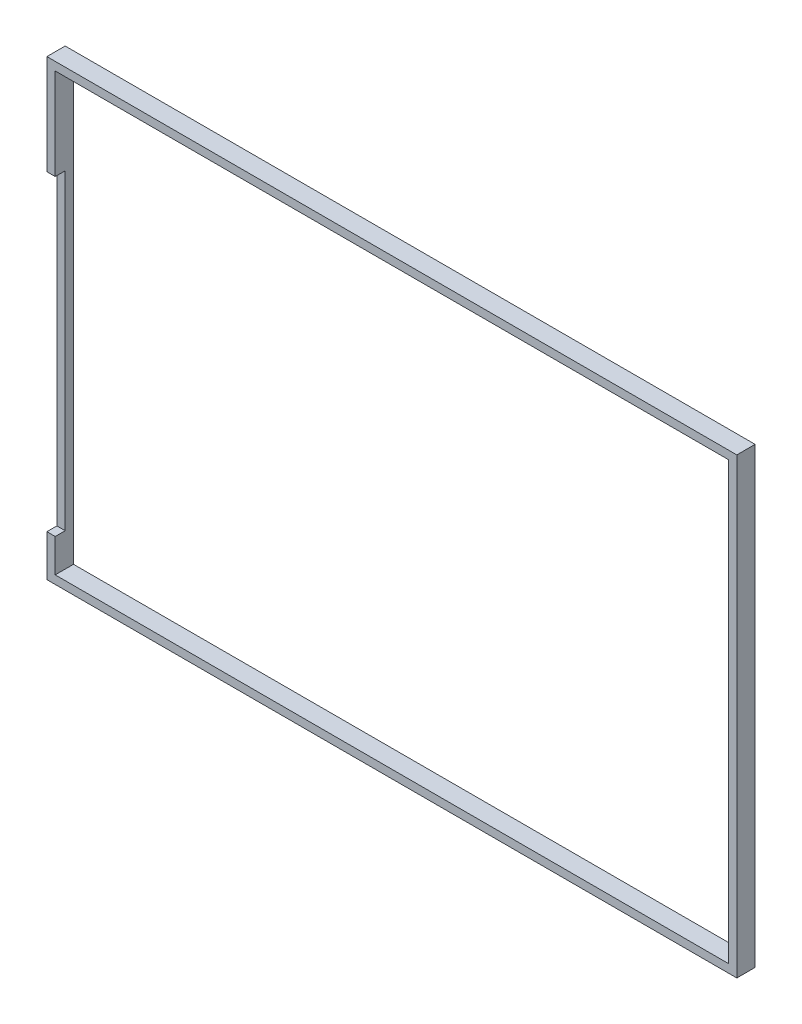
ISO-10303-21;
HEADER;
FILE_DESCRIPTION(('STEP AP214'),'2;1');
FILE_NAME('part.step','',(''),(''),'','','');
FILE_SCHEMA(('AUTOMOTIVE_DESIGN { 1 0 10303 214 1 1 1 1 }'));
ENDSEC;
DATA;
#1=APPLICATION_CONTEXT('core data for automotive mechanical design processes');
#2=APPLICATION_PROTOCOL_DEFINITION('international standard','automotive_design',2000,#1);
#3=PRODUCT_CONTEXT('',#1,'mechanical');
#4=PRODUCT('Part','Part','',(#3));
#5=PRODUCT_RELATED_PRODUCT_CATEGORY('part','',(#4));
#6=PRODUCT_DEFINITION_FORMATION('','',#4);
#7=PRODUCT_DEFINITION_CONTEXT('part definition',#1,'design');
#8=PRODUCT_DEFINITION('design','',#6,#7);
#9=PRODUCT_DEFINITION_SHAPE('','',#8);
#10=(LENGTH_UNIT() NAMED_UNIT(*) SI_UNIT(.MILLI.,.METRE.));
#11=(NAMED_UNIT(*) PLANE_ANGLE_UNIT() SI_UNIT($,.RADIAN.));
#12=(NAMED_UNIT(*) SI_UNIT($,.STERADIAN.) SOLID_ANGLE_UNIT());
#13=UNCERTAINTY_MEASURE_WITH_UNIT(LENGTH_MEASURE(1.E-05),#10,'distance_accuracy_value','');
#14=(GEOMETRIC_REPRESENTATION_CONTEXT(3) GLOBAL_UNCERTAINTY_ASSIGNED_CONTEXT((#13)) GLOBAL_UNIT_ASSIGNED_CONTEXT((#10,
#11,#12)) REPRESENTATION_CONTEXT('',''));
#15=CARTESIAN_POINT('',(0.,0.,0.));
#16=DIRECTION('',(0.,0.,1.));
#17=DIRECTION('',(1.,0.,0.));
#18=AXIS2_PLACEMENT_3D('',#15,#16,#17);
#19=CARTESIAN_POINT('',(-40.5,-22.25,-7.8));
#20=DIRECTION('',(0.,-1.,0.));
#21=DIRECTION('',(1.,0.,0.));
#22=AXIS2_PLACEMENT_3D('',#19,#20,#21);
#23=PLANE('',#22);
#24=DIRECTION('',(0.,0.,1.));
#25=VECTOR('',#24,1.);
#26=CARTESIAN_POINT('',(-41.5,-22.25,2.2));
#27=LINE('',#26,#25);
#28=CARTESIAN_POINT('',(-41.5,-22.25,1.));
#29=VERTEX_POINT('',#28);
#30=CARTESIAN_POINT('',(-41.5,-22.25,2.2));
#31=VERTEX_POINT('',#30);
#32=EDGE_CURVE('E144',#29,#31,#27,.T.);
#33=ORIENTED_EDGE('',*,*,#32,.T.);
#34=DIRECTION('',(1.,0.,0.));
#35=VECTOR('',#34,1.);
#36=CARTESIAN_POINT('',(0.,-22.25,2.2));
#37=LINE('',#36,#35);
#38=CARTESIAN_POINT('',(-40.5,-22.25,2.2));
#39=VERTEX_POINT('',#38);
#40=EDGE_CURVE('E123',#39,#31,#37,.F.);
#41=ORIENTED_EDGE('',*,*,#40,.F.);
#42=DIRECTION('',(0.,0.,1.));
#43=VECTOR('',#42,1.);
#44=CARTESIAN_POINT('',(-40.5,-22.25,-7.8));
#45=LINE('',#44,#43);
#46=CARTESIAN_POINT('',(-40.5,-22.25,0.999999999999999));
#47=VERTEX_POINT('',#46);
#48=EDGE_CURVE('E146',#39,#47,#45,.F.);
#49=ORIENTED_EDGE('',*,*,#48,.T.);
#50=DIRECTION('',(-1.,0.,0.));
#51=VECTOR('',#50,1.);
#52=CARTESIAN_POINT('',(-41.5000000000001,-22.25,1.));
#53=LINE('',#52,#51);
#54=EDGE_CURVE('E20',#47,#29,#53,.T.);
#55=ORIENTED_EDGE('',*,*,#54,.T.);
#56=EDGE_LOOP('',(#33,#41,#49,#55));
#57=FACE_BOUND('',#56,.T.);
#58=ADVANCED_FACE('F17',(#57),#23,.F.);
#59=CARTESIAN_POINT('',(-41.5000000000001,-23.6642135623731,1.));
#60=DIRECTION('',(0.,0.,-1.));
#61=DIRECTION('',(-1.,0.,0.));
#62=AXIS2_PLACEMENT_3D('',#59,#60,#61);
#63=PLANE('',#62);
#64=DIRECTION('',(0.,1.,0.));
#65=VECTOR('',#64,1.);
#66=CARTESIAN_POINT('',(-40.5,15.25,0.999999999999999));
#67=LINE('',#66,#65);
#68=CARTESIAN_POINT('',(-40.5,15.25,1.));
#69=VERTEX_POINT('',#68);
#70=EDGE_CURVE('E172',#47,#69,#67,.T.);
#71=ORIENTED_EDGE('',*,*,#70,.T.);
#72=DIRECTION('',(1.,0.,0.));
#73=VECTOR('',#72,1.);
#74=CARTESIAN_POINT('',(-41.5,15.25,0.999999999999999));
#75=LINE('',#74,#73);
#76=CARTESIAN_POINT('',(-41.5,15.25,0.999999999999999));
#77=VERTEX_POINT('',#76);
#78=EDGE_CURVE('E135',#69,#77,#75,.F.);
#79=ORIENTED_EDGE('',*,*,#78,.T.);
#80=DIRECTION('',(0.,1.,0.));
#81=VECTOR('',#80,1.);
#82=CARTESIAN_POINT('',(-41.5,-77.3738384490617,0.999999999999999));
#83=LINE('',#82,#81);
#84=EDGE_CURVE('E152',#77,#29,#83,.F.);
#85=ORIENTED_EDGE('',*,*,#84,.T.);
#86=ORIENTED_EDGE('',*,*,#54,.F.);
#87=EDGE_LOOP('',(#71,#79,#85,#86));
#88=FACE_BOUND('',#87,.T.);
#89=ADVANCED_FACE('F157',(#88),#63,.F.);
#90=CARTESIAN_POINT('',(-41.5,15.25,-7.8));
#91=DIRECTION('',(0.,1.,0.));
#92=DIRECTION('',(0.,0.,1.));
#93=AXIS2_PLACEMENT_3D('',#90,#91,#92);
#94=PLANE('',#93);
#95=DIRECTION('',(0.,0.,1.));
#96=VECTOR('',#95,1.);
#97=CARTESIAN_POINT('',(-40.5,15.2500000000001,-7.8));
#98=LINE('',#97,#96);
#99=CARTESIAN_POINT('',(-40.5,15.25,2.2));
#100=VERTEX_POINT('',#99);
#101=EDGE_CURVE('E169',#69,#100,#98,.T.);
#102=ORIENTED_EDGE('',*,*,#101,.T.);
#103=DIRECTION('',(1.,0.,0.));
#104=VECTOR('',#103,1.);
#105=CARTESIAN_POINT('',(0.,15.25,2.2));
#106=LINE('',#105,#104);
#107=CARTESIAN_POINT('',(-41.5,15.25,2.2));
#108=VERTEX_POINT('',#107);
#109=EDGE_CURVE('E134',#108,#100,#106,.T.);
#110=ORIENTED_EDGE('',*,*,#109,.F.);
#111=DIRECTION('',(0.,0.,1.));
#112=VECTOR('',#111,1.);
#113=CARTESIAN_POINT('',(-41.5,15.25,2.2));
#114=LINE('',#113,#112);
#115=EDGE_CURVE('E158',#108,#77,#114,.F.);
#116=ORIENTED_EDGE('',*,*,#115,.T.);
#117=ORIENTED_EDGE('',*,*,#78,.F.);
#118=EDGE_LOOP('',(#102,#110,#116,#117));
#119=FACE_BOUND('',#118,.T.);
#120=ADVANCED_FACE('F167',(#119),#94,.F.);
#121=CARTESIAN_POINT('',(0.,-77.3738384490617,2.2));
#122=DIRECTION('',(0.,0.,1.));
#123=DIRECTION('',(1.,0.,0.));
#124=AXIS2_PLACEMENT_3D('',#121,#122,#123);
#125=PLANE('',#124);
#126=DIRECTION('',(1.,0.,0.));
#127=VECTOR('',#126,1.);
#128=CARTESIAN_POINT('',(0.,27.25,2.2));
#129=LINE('',#128,#127);
#130=CARTESIAN_POINT('',(-41.5,27.25,2.2));
#131=VERTEX_POINT('',#130);
#132=CARTESIAN_POINT('',(41.5,27.25,2.2));
#133=VERTEX_POINT('',#132);
#134=EDGE_CURVE('E104',#131,#133,#129,.T.);
#135=ORIENTED_EDGE('',*,*,#134,.F.);
#136=DIRECTION('',(0.,1.,0.));
#137=VECTOR('',#136,1.);
#138=CARTESIAN_POINT('',(-41.5,-77.3738384490617,2.2));
#139=LINE('',#138,#137);
#140=EDGE_CURVE('E129',#131,#108,#139,.F.);
#141=ORIENTED_EDGE('',*,*,#140,.T.);
#142=ORIENTED_EDGE('',*,*,#109,.T.);
#143=DIRECTION('',(0.,1.,0.));
#144=VECTOR('',#143,1.);
#145=CARTESIAN_POINT('',(-40.5,15.25,2.2));
#146=LINE('',#145,#144);
#147=CARTESIAN_POINT('',(-40.5,26.25,2.2));
#148=VERTEX_POINT('',#147);
#149=EDGE_CURVE('E171',#100,#148,#146,.T.);
#150=ORIENTED_EDGE('',*,*,#149,.T.);
#151=DIRECTION('',(1.,0.,0.));
#152=VECTOR('',#151,1.);
#153=CARTESIAN_POINT('',(-40.5,26.25,2.2));
#154=LINE('',#153,#152);
#155=CARTESIAN_POINT('',(40.5,26.25,2.2));
#156=VERTEX_POINT('',#155);
#157=EDGE_CURVE('E214',#148,#156,#154,.T.);
#158=ORIENTED_EDGE('',*,*,#157,.T.);
#159=DIRECTION('',(0.,1.,0.));
#160=VECTOR('',#159,1.);
#161=CARTESIAN_POINT('',(40.5,26.25,2.2));
#162=LINE('',#161,#160);
#163=CARTESIAN_POINT('',(40.5,-26.25,2.2));
#164=VERTEX_POINT('',#163);
#165=EDGE_CURVE('E190',#156,#164,#162,.F.);
#166=ORIENTED_EDGE('',*,*,#165,.T.);
#167=DIRECTION('',(1.,0.,0.));
#168=VECTOR('',#167,1.);
#169=CARTESIAN_POINT('',(40.5,-26.25,2.2));
#170=LINE('',#169,#168);
#171=CARTESIAN_POINT('',(-40.5,-26.25,2.2));
#172=VERTEX_POINT('',#171);
#173=EDGE_CURVE('E185',#164,#172,#170,.F.);
#174=ORIENTED_EDGE('',*,*,#173,.T.);
#175=DIRECTION('',(0.,1.,0.));
#176=VECTOR('',#175,1.);
#177=CARTESIAN_POINT('',(-40.5,15.25,2.2));
#178=LINE('',#177,#176);
#179=EDGE_CURVE('E179',#172,#39,#178,.T.);
#180=ORIENTED_EDGE('',*,*,#179,.T.);
#181=ORIENTED_EDGE('',*,*,#40,.T.);
#182=DIRECTION('',(0.,1.,0.));
#183=VECTOR('',#182,1.);
#184=CARTESIAN_POINT('',(-41.5,-77.3738384490617,2.2));
#185=LINE('',#184,#183);
#186=CARTESIAN_POINT('',(-41.5,-27.25,2.2));
#187=VERTEX_POINT('',#186);
#188=EDGE_CURVE('E155',#31,#187,#185,.F.);
#189=ORIENTED_EDGE('',*,*,#188,.T.);
#190=DIRECTION('',(1.,0.,0.));
#191=VECTOR('',#190,1.);
#192=CARTESIAN_POINT('',(0.,-27.25,2.2));
#193=LINE('',#192,#191);
#194=CARTESIAN_POINT('',(41.5,-27.25,2.2));
#195=VERTEX_POINT('',#194);
#196=EDGE_CURVE('E119',#187,#195,#193,.T.);
#197=ORIENTED_EDGE('',*,*,#196,.T.);
#198=DIRECTION('',(0.,1.,0.));
#199=VECTOR('',#198,1.);
#200=CARTESIAN_POINT('',(41.5,-77.3738384490617,2.2));
#201=LINE('',#200,#199);
#202=EDGE_CURVE('E114',#133,#195,#201,.F.);
#203=ORIENTED_EDGE('',*,*,#202,.F.);
#204=EDGE_LOOP('',(#135,#141,#142,#150,#158,#166,#174,#180,#181,#189,#197,#203));
#205=FACE_BOUND('',#204,.T.);
#206=ADVANCED_FACE('F117',(#205),#125,.T.);
#207=CARTESIAN_POINT('',(41.5,-77.3738384490617,2.2));
#208=DIRECTION('',(1.,0.,0.));
#209=DIRECTION('',(0.,1.,0.));
#210=AXIS2_PLACEMENT_3D('',#207,#208,#209);
#211=PLANE('',#210);
#212=ORIENTED_EDGE('',*,*,#202,.T.);
#213=DIRECTION('',(0.,0.,1.));
#214=VECTOR('',#213,1.);
#215=CARTESIAN_POINT('',(41.5,-27.25,2.2));
#216=LINE('',#215,#214);
#217=CARTESIAN_POINT('',(41.5,-27.25,0.));
#218=VERTEX_POINT('',#217);
#219=EDGE_CURVE('E192',#195,#218,#216,.F.);
#220=ORIENTED_EDGE('',*,*,#219,.T.);
#221=DIRECTION('',(0.,1.,0.));
#222=VECTOR('',#221,1.);
#223=CARTESIAN_POINT('',(41.5,-77.3738384490617,0.));
#224=LINE('',#223,#222);
#225=CARTESIAN_POINT('',(41.5,27.25,0.));
#226=VERTEX_POINT('',#225);
#227=EDGE_CURVE('E127',#218,#226,#224,.T.);
#228=ORIENTED_EDGE('',*,*,#227,.T.);
#229=DIRECTION('',(0.,0.,1.));
#230=VECTOR('',#229,1.);
#231=CARTESIAN_POINT('',(41.5,27.25,2.2));
#232=LINE('',#231,#230);
#233=EDGE_CURVE('E111',#133,#226,#232,.F.);
#234=ORIENTED_EDGE('',*,*,#233,.F.);
#235=EDGE_LOOP('',(#212,#220,#228,#234));
#236=FACE_BOUND('',#235,.T.);
#237=ADVANCED_FACE('F126',(#236),#211,.T.);
#238=CARTESIAN_POINT('',(0.,27.25,2.2));
#239=DIRECTION('',(0.,1.,0.));
#240=DIRECTION('',(0.,0.,1.));
#241=AXIS2_PLACEMENT_3D('',#238,#239,#240);
#242=PLANE('',#241);
#243=ORIENTED_EDGE('',*,*,#134,.T.);
#244=ORIENTED_EDGE('',*,*,#233,.T.);
#245=DIRECTION('',(1.,0.,0.));
#246=VECTOR('',#245,1.);
#247=CARTESIAN_POINT('',(0.,27.25,0.));
#248=LINE('',#247,#246);
#249=CARTESIAN_POINT('',(-41.5,27.25,0.));
#250=VERTEX_POINT('',#249);
#251=EDGE_CURVE('E203',#226,#250,#248,.F.);
#252=ORIENTED_EDGE('',*,*,#251,.T.);
#253=DIRECTION('',(0.,0.,1.));
#254=VECTOR('',#253,1.);
#255=CARTESIAN_POINT('',(-41.5,27.25,2.2));
#256=LINE('',#255,#254);
#257=EDGE_CURVE('E113',#250,#131,#256,.T.);
#258=ORIENTED_EDGE('',*,*,#257,.T.);
#259=EDGE_LOOP('',(#243,#244,#252,#258));
#260=FACE_BOUND('',#259,.T.);
#261=ADVANCED_FACE('F108',(#260),#242,.T.);
#262=CARTESIAN_POINT('',(-41.5,-77.3738384490617,2.2));
#263=DIRECTION('',(1.,0.,0.));
#264=DIRECTION('',(0.,1.,0.));
#265=AXIS2_PLACEMENT_3D('',#262,#263,#264);
#266=PLANE('',#265);
#267=ORIENTED_EDGE('',*,*,#32,.F.);
#268=ORIENTED_EDGE('',*,*,#84,.F.);
#269=ORIENTED_EDGE('',*,*,#115,.F.);
#270=ORIENTED_EDGE('',*,*,#140,.F.);
#271=ORIENTED_EDGE('',*,*,#257,.F.);
#272=DIRECTION('',(0.,1.,0.));
#273=VECTOR('',#272,1.);
#274=CARTESIAN_POINT('',(-41.5,-77.3738384490617,0.));
#275=LINE('',#274,#273);
#276=CARTESIAN_POINT('',(-41.5,-27.25,0.));
#277=VERTEX_POINT('',#276);
#278=EDGE_CURVE('E200',#250,#277,#275,.F.);
#279=ORIENTED_EDGE('',*,*,#278,.T.);
#280=DIRECTION('',(0.,0.,1.));
#281=VECTOR('',#280,1.);
#282=CARTESIAN_POINT('',(-41.5,-27.25,2.2));
#283=LINE('',#282,#281);
#284=EDGE_CURVE('E195',#277,#187,#283,.T.);
#285=ORIENTED_EDGE('',*,*,#284,.T.);
#286=ORIENTED_EDGE('',*,*,#188,.F.);
#287=EDGE_LOOP('',(#267,#268,#269,#270,#271,#279,#285,#286));
#288=FACE_BOUND('',#287,.T.);
#289=ADVANCED_FACE('F150',(#288),#266,.F.);
#290=CARTESIAN_POINT('',(0.,-27.25,2.2));
#291=DIRECTION('',(0.,1.,0.));
#292=DIRECTION('',(0.,0.,1.));
#293=AXIS2_PLACEMENT_3D('',#290,#291,#292);
#294=PLANE('',#293);
#295=ORIENTED_EDGE('',*,*,#219,.F.);
#296=ORIENTED_EDGE('',*,*,#196,.F.);
#297=ORIENTED_EDGE('',*,*,#284,.F.);
#298=DIRECTION('',(1.,0.,0.));
#299=VECTOR('',#298,1.);
#300=CARTESIAN_POINT('',(0.,-27.25,0.));
#301=LINE('',#300,#299);
#302=EDGE_CURVE('E202',#277,#218,#301,.T.);
#303=ORIENTED_EDGE('',*,*,#302,.T.);
#304=EDGE_LOOP('',(#295,#296,#297,#303));
#305=FACE_BOUND('',#304,.T.);
#306=ADVANCED_FACE('F197',(#305),#294,.F.);
#307=CARTESIAN_POINT('',(40.5,26.25,-7.8));
#308=DIRECTION('',(1.,0.,0.));
#309=DIRECTION('',(0.,1.,0.));
#310=AXIS2_PLACEMENT_3D('',#307,#308,#309);
#311=PLANE('',#310);
#312=ORIENTED_EDGE('',*,*,#165,.F.);
#313=DIRECTION('',(0.,0.,1.));
#314=VECTOR('',#313,1.);
#315=CARTESIAN_POINT('',(40.5,26.25,-7.8));
#316=LINE('',#315,#314);
#317=CARTESIAN_POINT('',(40.5,26.25,0.));
#318=VERTEX_POINT('',#317);
#319=EDGE_CURVE('E211',#156,#318,#316,.F.);
#320=ORIENTED_EDGE('',*,*,#319,.T.);
#321=DIRECTION('',(0.,1.,0.));
#322=VECTOR('',#321,1.);
#323=CARTESIAN_POINT('',(40.5,-77.3738384490617,0.));
#324=LINE('',#323,#322);
#325=CARTESIAN_POINT('',(40.5,-26.25,0.));
#326=VERTEX_POINT('',#325);
#327=EDGE_CURVE('E205',#318,#326,#324,.F.);
#328=ORIENTED_EDGE('',*,*,#327,.T.);
#329=DIRECTION('',(0.,0.,1.));
#330=VECTOR('',#329,1.);
#331=CARTESIAN_POINT('',(40.5,-26.25,-7.8));
#332=LINE('',#331,#330);
#333=EDGE_CURVE('E187',#326,#164,#332,.T.);
#334=ORIENTED_EDGE('',*,*,#333,.T.);
#335=EDGE_LOOP('',(#312,#320,#328,#334));
#336=FACE_BOUND('',#335,.T.);
#337=ADVANCED_FACE('F228',(#336),#311,.F.);
#338=CARTESIAN_POINT('',(40.5,-26.25,-7.8));
#339=DIRECTION('',(0.,-1.,0.));
#340=DIRECTION('',(1.,0.,0.));
#341=AXIS2_PLACEMENT_3D('',#338,#339,#340);
#342=PLANE('',#341);
#343=ORIENTED_EDGE('',*,*,#173,.F.);
#344=ORIENTED_EDGE('',*,*,#333,.F.);
#345=DIRECTION('',(1.,0.,0.));
#346=VECTOR('',#345,1.);
#347=CARTESIAN_POINT('',(0.,-26.25,0.));
#348=LINE('',#347,#346);
#349=CARTESIAN_POINT('',(-40.5,-26.25,0.));
#350=VERTEX_POINT('',#349);
#351=EDGE_CURVE('E223',#326,#350,#348,.F.);
#352=ORIENTED_EDGE('',*,*,#351,.T.);
#353=DIRECTION('',(0.,0.,1.));
#354=VECTOR('',#353,1.);
#355=CARTESIAN_POINT('',(-40.5,-26.25,-7.8));
#356=LINE('',#355,#354);
#357=EDGE_CURVE('E182',#350,#172,#356,.T.);
#358=ORIENTED_EDGE('',*,*,#357,.T.);
#359=EDGE_LOOP('',(#343,#344,#352,#358));
#360=FACE_BOUND('',#359,.T.);
#361=ADVANCED_FACE('F233',(#360),#342,.F.);
#362=CARTESIAN_POINT('',(-40.5,15.25,-7.8));
#363=DIRECTION('',(-1.,0.,0.));
#364=DIRECTION('',(0.,0.,1.));
#365=AXIS2_PLACEMENT_3D('',#362,#363,#364);
#366=PLANE('',#365);
#367=ORIENTED_EDGE('',*,*,#149,.F.);
#368=ORIENTED_EDGE('',*,*,#101,.F.);
#369=ORIENTED_EDGE('',*,*,#70,.F.);
#370=ORIENTED_EDGE('',*,*,#48,.F.);
#371=ORIENTED_EDGE('',*,*,#179,.F.);
#372=ORIENTED_EDGE('',*,*,#357,.F.);
#373=DIRECTION('',(0.,1.,0.));
#374=VECTOR('',#373,1.);
#375=CARTESIAN_POINT('',(-40.5,-77.3738384490617,0.));
#376=LINE('',#375,#374);
#377=CARTESIAN_POINT('',(-40.5,26.25,0.));
#378=VERTEX_POINT('',#377);
#379=EDGE_CURVE('E26',#350,#378,#376,.T.);
#380=ORIENTED_EDGE('',*,*,#379,.T.);
#381=DIRECTION('',(0.,0.,1.));
#382=VECTOR('',#381,1.);
#383=CARTESIAN_POINT('',(-40.5,26.25,-7.8));
#384=LINE('',#383,#382);
#385=EDGE_CURVE('E34',#378,#148,#384,.T.);
#386=ORIENTED_EDGE('',*,*,#385,.T.);
#387=EDGE_LOOP('',(#367,#368,#369,#370,#371,#372,#380,#386));
#388=FACE_BOUND('',#387,.T.);
#389=ADVANCED_FACE('F217',(#388),#366,.F.);
#390=CARTESIAN_POINT('',(-40.5,26.25,-7.8));
#391=DIRECTION('',(0.,1.,0.));
#392=DIRECTION('',(0.,0.,1.));
#393=AXIS2_PLACEMENT_3D('',#390,#391,#392);
#394=PLANE('',#393);
#395=ORIENTED_EDGE('',*,*,#157,.F.);
#396=ORIENTED_EDGE('',*,*,#385,.F.);
#397=DIRECTION('',(1.,0.,0.));
#398=VECTOR('',#397,1.);
#399=CARTESIAN_POINT('',(0.,26.25,0.));
#400=LINE('',#399,#398);
#401=EDGE_CURVE('E11',#378,#318,#400,.T.);
#402=ORIENTED_EDGE('',*,*,#401,.T.);
#403=ORIENTED_EDGE('',*,*,#319,.F.);
#404=EDGE_LOOP('',(#395,#396,#402,#403));
#405=FACE_BOUND('',#404,.T.);
#406=ADVANCED_FACE('F234',(#405),#394,.F.);
#407=CARTESIAN_POINT('',(0.,-77.3738384490617,0.));
#408=DIRECTION('',(0.,0.,1.));
#409=DIRECTION('',(1.,0.,0.));
#410=AXIS2_PLACEMENT_3D('',#407,#408,#409);
#411=PLANE('',#410);
#412=ORIENTED_EDGE('',*,*,#379,.F.);
#413=ORIENTED_EDGE('',*,*,#351,.F.);
#414=ORIENTED_EDGE('',*,*,#327,.F.);
#415=ORIENTED_EDGE('',*,*,#401,.F.);
#416=EDGE_LOOP('',(#412,#413,#414,#415));
#417=FACE_BOUND('',#416,.T.);
#418=ORIENTED_EDGE('',*,*,#278,.F.);
#419=ORIENTED_EDGE('',*,*,#251,.F.);
#420=ORIENTED_EDGE('',*,*,#227,.F.);
#421=ORIENTED_EDGE('',*,*,#302,.F.);
#422=EDGE_LOOP('',(#418,#419,#420,#421));
#423=FACE_BOUND('',#422,.T.);
#424=ADVANCED_FACE('F230',(#417,#423),#411,.F.);
#425=CLOSED_SHELL('',(#58,#89,#120,#206,#237,#261,#289,#306,#337,#361,#389,#406,#424));
#426=MANIFOLD_SOLID_BREP('B1',#425);
#427=ADVANCED_BREP_SHAPE_REPRESENTATION('',(#18,#426),#14);
#428=SHAPE_DEFINITION_REPRESENTATION(#9,#427);
ENDSEC;
END-ISO-10303-21;
